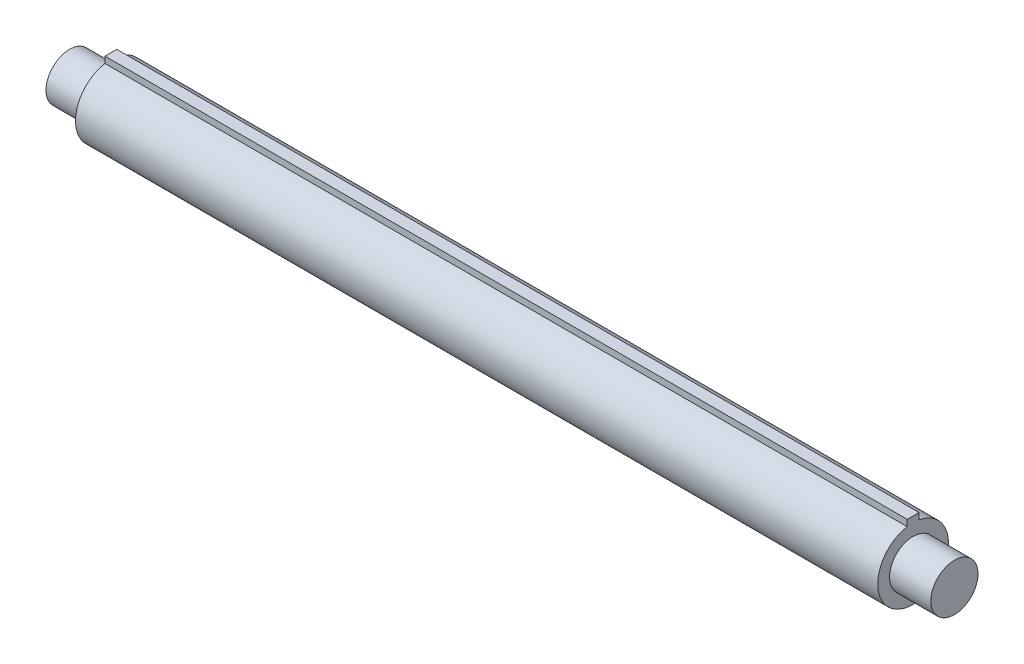
ISO-10303-21;
HEADER;
FILE_DESCRIPTION(('STEP AP214'),'2;1');
FILE_NAME('part.step','',(''),(''),'','','');
FILE_SCHEMA(('AUTOMOTIVE_DESIGN { 1 0 10303 214 1 1 1 1 }'));
ENDSEC;
DATA;
#1=APPLICATION_CONTEXT('core data for automotive mechanical design processes');
#2=APPLICATION_PROTOCOL_DEFINITION('international standard','automotive_design',2000,#1);
#3=PRODUCT_CONTEXT('',#1,'mechanical');
#4=PRODUCT('Part','Part','',(#3));
#5=PRODUCT_RELATED_PRODUCT_CATEGORY('part','',(#4));
#6=PRODUCT_DEFINITION_FORMATION('','',#4);
#7=PRODUCT_DEFINITION_CONTEXT('part definition',#1,'design');
#8=PRODUCT_DEFINITION('design','',#6,#7);
#9=PRODUCT_DEFINITION_SHAPE('','',#8);
#10=(LENGTH_UNIT() NAMED_UNIT(*) SI_UNIT(.MILLI.,.METRE.));
#11=(NAMED_UNIT(*) PLANE_ANGLE_UNIT() SI_UNIT($,.RADIAN.));
#12=(NAMED_UNIT(*) SI_UNIT($,.STERADIAN.) SOLID_ANGLE_UNIT());
#13=UNCERTAINTY_MEASURE_WITH_UNIT(LENGTH_MEASURE(1.E-05),#10,'distance_accuracy_value','');
#14=(GEOMETRIC_REPRESENTATION_CONTEXT(3) GLOBAL_UNCERTAINTY_ASSIGNED_CONTEXT((#13)) GLOBAL_UNIT_ASSIGNED_CONTEXT((#10,
#11,#12)) REPRESENTATION_CONTEXT('',''));
#15=CARTESIAN_POINT('',(0.,0.,0.));
#16=DIRECTION('',(0.,0.,1.));
#17=DIRECTION('',(1.,0.,0.));
#18=AXIS2_PLACEMENT_3D('',#15,#16,#17);
#19=CARTESIAN_POINT('',(0.,1.99999999999998,0.));
#20=DIRECTION('',(1.,0.,0.));
#21=DIRECTION('',(0.,1.,0.));
#22=AXIS2_PLACEMENT_3D('',#19,#20,#21);
#23=PLANE('',#22);
#24=CARTESIAN_POINT('',(0.,0.,0.));
#25=DIRECTION('',(1.,0.,0.));
#26=DIRECTION('',(0.,1.,0.));
#27=AXIS2_PLACEMENT_3D('',#24,#25,#26);
#28=CIRCLE('',#27,1.99999999999998);
#29=CARTESIAN_POINT('',(0.,1.99999999999998,0.));
#30=VERTEX_POINT('',#29);
#31=EDGE_CURVE('E127',#30,#30,#28,.T.);
#32=ORIENTED_EDGE('',*,*,#31,.T.);
#33=EDGE_LOOP('',(#32));
#34=FACE_BOUND('',#33,.T.);
#35=ADVANCED_FACE('F43',(#34),#23,.T.);
#36=CARTESIAN_POINT('',(-75.,0.,0.));
#37=DIRECTION('',(-1.,0.,0.));
#38=DIRECTION('',(0.,-1.,0.));
#39=AXIS2_PLACEMENT_3D('',#36,#37,#38);
#40=PLANE('',#39);
#41=CARTESIAN_POINT('',(-75.,0.,0.));
#42=DIRECTION('',(1.,0.,0.));
#43=DIRECTION('',(0.,1.,0.));
#44=AXIS2_PLACEMENT_3D('',#41,#42,#43);
#45=CIRCLE('',#44,1.99999999999999);
#46=CARTESIAN_POINT('',(-75.,1.99999999999998,0.));
#47=VERTEX_POINT('',#46);
#48=EDGE_CURVE('E11',#47,#47,#45,.T.);
#49=ORIENTED_EDGE('',*,*,#48,.F.);
#50=EDGE_LOOP('',(#49));
#51=FACE_BOUND('',#50,.T.);
#52=ADVANCED_FACE('F146',(#51),#40,.T.);
#53=CARTESIAN_POINT('',(0.,0.,0.));
#54=DIRECTION('',(1.,0.,0.));
#55=DIRECTION('',(0.,1.,0.));
#56=AXIS2_PLACEMENT_3D('',#53,#54,#55);
#57=CYLINDRICAL_SURFACE('',#56,1.99999999999999);
#58=ORIENTED_EDGE('',*,*,#48,.T.);
#59=EDGE_LOOP('',(#58));
#60=FACE_BOUND('',#59,.T.);
#61=CARTESIAN_POINT('',(-71.5,0.,0.));
#62=DIRECTION('',(1.,0.,0.));
#63=DIRECTION('',(0.,1.,0.));
#64=AXIS2_PLACEMENT_3D('',#61,#62,#63);
#65=CIRCLE('',#64,1.99999999999999);
#66=CARTESIAN_POINT('',(-71.5,1.99999999999998,0.));
#67=VERTEX_POINT('',#66);
#68=EDGE_CURVE('E51',#67,#67,#65,.T.);
#69=ORIENTED_EDGE('',*,*,#68,.F.);
#70=EDGE_LOOP('',(#69));
#71=FACE_BOUND('',#70,.T.);
#72=ADVANCED_FACE('F144',(#60,#71),#57,.T.);
#73=CARTESIAN_POINT('',(-71.5,1.99999999999998,0.));
#74=DIRECTION('',(-1.,0.,0.));
#75=DIRECTION('',(0.,-1.,0.));
#76=AXIS2_PLACEMENT_3D('',#73,#74,#75);
#77=PLANE('',#76);
#78=DIRECTION('',(0.,-1.,0.));
#79=VECTOR('',#78,1.);
#80=CARTESIAN_POINT('',(-71.5,2.49999999999999,-0.5));
#81=LINE('',#80,#79);
#82=CARTESIAN_POINT('',(-71.5,3.49999999999999,-0.5));
#83=VERTEX_POINT('',#82);
#84=CARTESIAN_POINT('',(-71.5,2.9580398915498,-0.5));
#85=VERTEX_POINT('',#84);
#86=EDGE_CURVE('E100',#83,#85,#81,.T.);
#87=ORIENTED_EDGE('',*,*,#86,.T.);
#88=CARTESIAN_POINT('',(-71.5,0.,0.));
#89=DIRECTION('',(1.,0.,0.));
#90=DIRECTION('',(0.,1.,0.));
#91=AXIS2_PLACEMENT_3D('',#88,#89,#90);
#92=CIRCLE('',#91,3.);
#93=CARTESIAN_POINT('',(-71.5,2.9580398915498,0.5));
#94=VERTEX_POINT('',#93);
#95=EDGE_CURVE('E58',#94,#85,#92,.T.);
#96=ORIENTED_EDGE('',*,*,#95,.F.);
#97=DIRECTION('',(0.,1.,0.));
#98=VECTOR('',#97,1.);
#99=CARTESIAN_POINT('',(-71.5,2.49999999999999,0.5));
#100=LINE('',#99,#98);
#101=CARTESIAN_POINT('',(-71.5,3.49999999999999,0.5));
#102=VERTEX_POINT('',#101);
#103=EDGE_CURVE('E116',#94,#102,#100,.T.);
#104=ORIENTED_EDGE('',*,*,#103,.T.);
#105=DIRECTION('',(0.,0.,-1.));
#106=VECTOR('',#105,1.);
#107=CARTESIAN_POINT('',(-71.5,3.49999999999999,-0.5));
#108=LINE('',#107,#106);
#109=EDGE_CURVE('E112',#102,#83,#108,.T.);
#110=ORIENTED_EDGE('',*,*,#109,.T.);
#111=EDGE_LOOP('',(#87,#96,#104,#110));
#112=FACE_BOUND('',#111,.T.);
#113=ORIENTED_EDGE('',*,*,#68,.T.);
#114=EDGE_LOOP('',(#113));
#115=FACE_BOUND('',#114,.T.);
#116=ADVANCED_FACE('F142',(#112,#115),#77,.T.);
#117=CARTESIAN_POINT('',(0.,0.,0.));
#118=DIRECTION('',(1.,0.,0.));
#119=DIRECTION('',(0.,1.,0.));
#120=AXIS2_PLACEMENT_3D('',#117,#118,#119);
#121=CYLINDRICAL_SURFACE('',#120,3.);
#122=DIRECTION('',(1.,0.,0.));
#123=VECTOR('',#122,1.);
#124=CARTESIAN_POINT('',(0.,2.9580398915498,-0.5));
#125=LINE('',#124,#123);
#126=CARTESIAN_POINT('',(-3.5,2.9580398915498,-0.5));
#127=VERTEX_POINT('',#126);
#128=EDGE_CURVE('E124',#127,#85,#125,.F.);
#129=ORIENTED_EDGE('',*,*,#128,.F.);
#130=CARTESIAN_POINT('',(-3.5,0.,0.));
#131=DIRECTION('',(1.,0.,0.));
#132=DIRECTION('',(0.,1.,0.));
#133=AXIS2_PLACEMENT_3D('',#130,#131,#132);
#134=CIRCLE('',#133,2.99999999999999);
#135=CARTESIAN_POINT('',(-3.5,2.9580398915498,0.5));
#136=VERTEX_POINT('',#135);
#137=EDGE_CURVE('E91',#136,#127,#134,.T.);
#138=ORIENTED_EDGE('',*,*,#137,.F.);
#139=DIRECTION('',(1.,0.,0.));
#140=VECTOR('',#139,1.);
#141=CARTESIAN_POINT('',(0.,2.9580398915498,0.5));
#142=LINE('',#141,#140);
#143=EDGE_CURVE('E63',#94,#136,#142,.T.);
#144=ORIENTED_EDGE('',*,*,#143,.F.);
#145=ORIENTED_EDGE('',*,*,#95,.T.);
#146=EDGE_LOOP('',(#129,#138,#144,#145));
#147=FACE_BOUND('',#146,.T.);
#148=ADVANCED_FACE('F154',(#147),#121,.T.);
#149=CARTESIAN_POINT('',(-3.5,2.99999999999999,0.));
#150=DIRECTION('',(1.,0.,0.));
#151=DIRECTION('',(0.,1.,0.));
#152=AXIS2_PLACEMENT_3D('',#149,#150,#151);
#153=PLANE('',#152);
#154=ORIENTED_EDGE('',*,*,#137,.T.);
#155=DIRECTION('',(0.,-1.,0.));
#156=VECTOR('',#155,1.);
#157=CARTESIAN_POINT('',(-3.5,2.5,-0.5));
#158=LINE('',#157,#156);
#159=CARTESIAN_POINT('',(-3.5,3.5,-0.5));
#160=VERTEX_POINT('',#159);
#161=EDGE_CURVE('E83',#160,#127,#158,.T.);
#162=ORIENTED_EDGE('',*,*,#161,.F.);
#163=DIRECTION('',(0.,0.,-1.));
#164=VECTOR('',#163,1.);
#165=CARTESIAN_POINT('',(-3.5,3.5,-0.5));
#166=LINE('',#165,#164);
#167=CARTESIAN_POINT('',(-3.5,3.5,0.5));
#168=VERTEX_POINT('',#167);
#169=EDGE_CURVE('E89',#168,#160,#166,.T.);
#170=ORIENTED_EDGE('',*,*,#169,.F.);
#171=DIRECTION('',(0.,1.,0.));
#172=VECTOR('',#171,1.);
#173=CARTESIAN_POINT('',(-3.5,2.5,0.5));
#174=LINE('',#173,#172);
#175=EDGE_CURVE('E94',#136,#168,#174,.T.);
#176=ORIENTED_EDGE('',*,*,#175,.F.);
#177=EDGE_LOOP('',(#154,#162,#170,#176));
#178=FACE_BOUND('',#177,.T.);
#179=CARTESIAN_POINT('',(-3.5,0.,0.));
#180=DIRECTION('',(1.,0.,0.));
#181=DIRECTION('',(0.,1.,0.));
#182=AXIS2_PLACEMENT_3D('',#179,#180,#181);
#183=CIRCLE('',#182,1.99999999999998);
#184=CARTESIAN_POINT('',(-3.5,1.99999999999998,0.));
#185=VERTEX_POINT('',#184);
#186=EDGE_CURVE('E131',#185,#185,#183,.T.);
#187=ORIENTED_EDGE('',*,*,#186,.F.);
#188=EDGE_LOOP('',(#187));
#189=FACE_BOUND('',#188,.T.);
#190=ADVANCED_FACE('F85',(#178,#189),#153,.T.);
#191=CARTESIAN_POINT('',(0.,0.,0.));
#192=DIRECTION('',(1.,0.,0.));
#193=DIRECTION('',(0.,1.,0.));
#194=AXIS2_PLACEMENT_3D('',#191,#192,#193);
#195=CYLINDRICAL_SURFACE('',#194,1.99999999999998);
#196=ORIENTED_EDGE('',*,*,#186,.T.);
#197=EDGE_LOOP('',(#196));
#198=FACE_BOUND('',#197,.T.);
#199=ORIENTED_EDGE('',*,*,#31,.F.);
#200=EDGE_LOOP('',(#199));
#201=FACE_BOUND('',#200,.T.);
#202=ADVANCED_FACE('F164',(#198,#201),#195,.T.);
#203=CARTESIAN_POINT('',(-2.08578643762691,3.5,-0.5));
#204=DIRECTION('',(0.,1.,0.));
#205=DIRECTION('',(-1.,0.,0.));
#206=AXIS2_PLACEMENT_3D('',#203,#204,#205);
#207=PLANE('',#206);
#208=DIRECTION('',(-1.,0.,0.));
#209=VECTOR('',#208,1.);
#210=CARTESIAN_POINT('',(-2.08578643762691,3.5,0.5));
#211=LINE('',#210,#209);
#212=EDGE_CURVE('E108',#168,#102,#211,.T.);
#213=ORIENTED_EDGE('',*,*,#212,.F.);
#214=ORIENTED_EDGE('',*,*,#169,.T.);
#215=DIRECTION('',(-1.,0.,0.));
#216=VECTOR('',#215,1.);
#217=CARTESIAN_POINT('',(-2.08578643762691,3.5,-0.5));
#218=LINE('',#217,#216);
#219=EDGE_CURVE('E95',#160,#83,#218,.T.);
#220=ORIENTED_EDGE('',*,*,#219,.T.);
#221=ORIENTED_EDGE('',*,*,#109,.F.);
#222=EDGE_LOOP('',(#213,#214,#220,#221));
#223=FACE_BOUND('',#222,.T.);
#224=ADVANCED_FACE('F106',(#223),#207,.T.);
#225=CARTESIAN_POINT('',(-2.08578643762691,2.5,-0.5));
#226=DIRECTION('',(0.,0.,-1.));
#227=DIRECTION('',(-1.,0.,0.));
#228=AXIS2_PLACEMENT_3D('',#225,#226,#227);
#229=PLANE('',#228);
#230=ORIENTED_EDGE('',*,*,#161,.T.);
#231=ORIENTED_EDGE('',*,*,#128,.T.);
#232=ORIENTED_EDGE('',*,*,#86,.F.);
#233=ORIENTED_EDGE('',*,*,#219,.F.);
#234=EDGE_LOOP('',(#230,#231,#232,#233));
#235=FACE_BOUND('',#234,.T.);
#236=ADVANCED_FACE('F98',(#235),#229,.T.);
#237=CARTESIAN_POINT('',(-2.08578643762691,2.5,0.5));
#238=DIRECTION('',(0.,0.,1.));
#239=DIRECTION('',(1.,0.,0.));
#240=AXIS2_PLACEMENT_3D('',#237,#238,#239);
#241=PLANE('',#240);
#242=ORIENTED_EDGE('',*,*,#103,.F.);
#243=ORIENTED_EDGE('',*,*,#143,.T.);
#244=ORIENTED_EDGE('',*,*,#175,.T.);
#245=ORIENTED_EDGE('',*,*,#212,.T.);
#246=EDGE_LOOP('',(#242,#243,#244,#245));
#247=FACE_BOUND('',#246,.T.);
#248=ADVANCED_FACE('F182',(#247),#241,.T.);
#249=CLOSED_SHELL('',(#35,#52,#72,#116,#148,#190,#202,#224,#236,#248));
#250=MANIFOLD_SOLID_BREP('B2',#249);
#251=ADVANCED_BREP_SHAPE_REPRESENTATION('',(#18,#250),#14);
#252=SHAPE_DEFINITION_REPRESENTATION(#9,#251);
ENDSEC;
END-ISO-10303-21;
